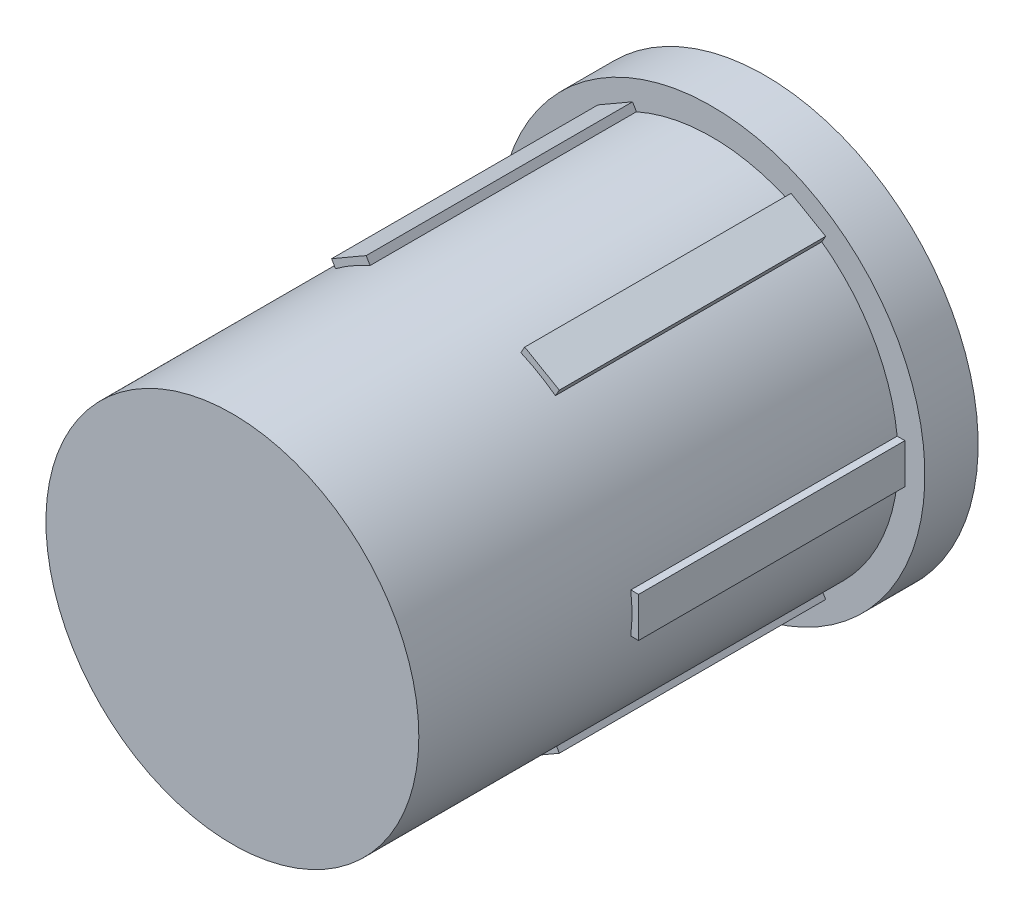
ISO-10303-21;
HEADER;
FILE_DESCRIPTION(('STEP AP214'),'2;1');
FILE_NAME('part.step','',(''),(''),'','','');
FILE_SCHEMA(('AUTOMOTIVE_DESIGN { 1 0 10303 214 1 1 1 1 }'));
ENDSEC;
DATA;
#1=APPLICATION_CONTEXT('core data for automotive mechanical design processes');
#2=APPLICATION_PROTOCOL_DEFINITION('international standard','automotive_design',2000,#1);
#3=PRODUCT_CONTEXT('',#1,'mechanical');
#4=PRODUCT('Part','Part','',(#3));
#5=PRODUCT_RELATED_PRODUCT_CATEGORY('part','',(#4));
#6=PRODUCT_DEFINITION_FORMATION('','',#4);
#7=PRODUCT_DEFINITION_CONTEXT('part definition',#1,'design');
#8=PRODUCT_DEFINITION('design','',#6,#7);
#9=PRODUCT_DEFINITION_SHAPE('','',#8);
#10=(LENGTH_UNIT() NAMED_UNIT(*) SI_UNIT(.MILLI.,.METRE.));
#11=(NAMED_UNIT(*) PLANE_ANGLE_UNIT() SI_UNIT($,.RADIAN.));
#12=(NAMED_UNIT(*) SI_UNIT($,.STERADIAN.) SOLID_ANGLE_UNIT());
#13=UNCERTAINTY_MEASURE_WITH_UNIT(LENGTH_MEASURE(1.E-05),#10,'distance_accuracy_value','');
#14=(GEOMETRIC_REPRESENTATION_CONTEXT(3) GLOBAL_UNCERTAINTY_ASSIGNED_CONTEXT((#13)) GLOBAL_UNIT_ASSIGNED_CONTEXT((#10,
#11,#12)) REPRESENTATION_CONTEXT('',''));
#15=CARTESIAN_POINT('',(0.,0.,0.));
#16=DIRECTION('',(0.,0.,1.));
#17=DIRECTION('',(1.,0.,0.));
#18=AXIS2_PLACEMENT_3D('',#15,#16,#17);
#19=CARTESIAN_POINT('',(0.,0.,3.6));
#20=DIRECTION('',(0.,0.,-1.));
#21=DIRECTION('',(-1.,0.,0.));
#22=AXIS2_PLACEMENT_3D('',#19,#20,#21);
#23=CYLINDRICAL_SURFACE('',#22,1.4);
#24=CARTESIAN_POINT('',(0.,0.,3.6));
#25=DIRECTION('',(0.,0.,1.));
#26=DIRECTION('',(1.,0.,0.));
#27=AXIS2_PLACEMENT_3D('',#24,#25,#26);
#28=CIRCLE('',#27,1.4);
#29=CARTESIAN_POINT('',(1.4,0.,3.6));
#30=VERTEX_POINT('',#29);
#31=EDGE_CURVE('E346',#30,#30,#28,.T.);
#32=ORIENTED_EDGE('',*,*,#31,.F.);
#33=EDGE_LOOP('',(#32));
#34=FACE_BOUND('',#33,.T.);
#35=CARTESIAN_POINT('',(0.,0.,0.));
#36=DIRECTION('',(0.,0.,-1.));
#37=DIRECTION('',(-1.,0.,0.));
#38=AXIS2_PLACEMENT_3D('',#35,#36,#37);
#39=CIRCLE('',#38,1.4);
#40=CARTESIAN_POINT('',(-0.825874355921432,-1.13045634512411,0.));
#41=VERTEX_POINT('',#40);
#42=CARTESIAN_POINT('',(-1.39194109070751,-0.15,0.));
#43=VERTEX_POINT('',#42);
#44=EDGE_CURVE('E341',#41,#43,#39,.T.);
#45=ORIENTED_EDGE('',*,*,#44,.F.);
#46=DIRECTION('',(0.,0.,-1.));
#47=VECTOR('',#46,1.);
#48=CARTESIAN_POINT('',(-0.825874355921432,-1.13045634512411,3.6));
#49=LINE('',#48,#47);
#50=CARTESIAN_POINT('',(-0.825874355921432,-1.13045634512411,2.));
#51=VERTEX_POINT('',#50);
#52=EDGE_CURVE('E50',#41,#51,#49,.F.);
#53=ORIENTED_EDGE('',*,*,#52,.T.);
#54=CARTESIAN_POINT('',(0.,0.,1.99999999999999));
#55=DIRECTION('',(0.,0.,-1.));
#56=DIRECTION('',(0.,1.,0.));
#57=AXIS2_PLACEMENT_3D('',#54,#55,#56);
#58=CIRCLE('',#57,1.4);
#59=CARTESIAN_POINT('',(-0.566066734786102,-1.28045634512411,2.));
#60=VERTEX_POINT('',#59);
#61=EDGE_CURVE('E11',#60,#51,#58,.T.);
#62=ORIENTED_EDGE('',*,*,#61,.F.);
#63=DIRECTION('',(0.,0.,-1.));
#64=VECTOR('',#63,1.);
#65=CARTESIAN_POINT('',(-0.566066734786102,-1.28045634512411,3.6));
#66=LINE('',#65,#64);
#67=CARTESIAN_POINT('',(-0.566066734786102,-1.28045634512411,0.));
#68=VERTEX_POINT('',#67);
#69=EDGE_CURVE('E215',#68,#60,#66,.F.);
#70=ORIENTED_EDGE('',*,*,#69,.F.);
#71=CARTESIAN_POINT('',(0.566066734786075,-1.28045634512412,0.));
#72=VERTEX_POINT('',#71);
#73=EDGE_CURVE('E395',#72,#68,#39,.T.);
#74=ORIENTED_EDGE('',*,*,#73,.F.);
#75=DIRECTION('',(0.,0.,-1.));
#76=VECTOR('',#75,1.);
#77=CARTESIAN_POINT('',(0.566066734786075,-1.28045634512412,3.6));
#78=LINE('',#77,#76);
#79=CARTESIAN_POINT('',(0.566066734786075,-1.28045634512412,2.));
#80=VERTEX_POINT('',#79);
#81=EDGE_CURVE('E243',#72,#80,#78,.F.);
#82=ORIENTED_EDGE('',*,*,#81,.T.);
#83=CARTESIAN_POINT('',(0.,0.,1.99999999999999));
#84=DIRECTION('',(0.,0.,-1.));
#85=DIRECTION('',(0.,1.,0.));
#86=AXIS2_PLACEMENT_3D('',#83,#84,#85);
#87=CIRCLE('',#86,1.4);
#88=CARTESIAN_POINT('',(0.825874355921408,-1.13045634512413,2.));
#89=VERTEX_POINT('',#88);
#90=EDGE_CURVE('E387',#89,#80,#87,.T.);
#91=ORIENTED_EDGE('',*,*,#90,.F.);
#92=DIRECTION('',(0.,0.,-1.));
#93=VECTOR('',#92,1.);
#94=CARTESIAN_POINT('',(0.825874355921408,-1.13045634512413,3.6));
#95=LINE('',#94,#93);
#96=CARTESIAN_POINT('',(0.825874355921408,-1.13045634512413,0.));
#97=VERTEX_POINT('',#96);
#98=EDGE_CURVE('E240',#97,#89,#95,.F.);
#99=ORIENTED_EDGE('',*,*,#98,.F.);
#100=CARTESIAN_POINT('',(1.39194109070751,-0.15,0.));
#101=VERTEX_POINT('',#100);
#102=EDGE_CURVE('E396',#101,#97,#39,.T.);
#103=ORIENTED_EDGE('',*,*,#102,.F.);
#104=DIRECTION('',(0.,0.,-1.));
#105=VECTOR('',#104,1.);
#106=CARTESIAN_POINT('',(1.39194109070751,-0.15,3.6));
#107=LINE('',#106,#105);
#108=CARTESIAN_POINT('',(1.39194109070751,-0.15,2.));
#109=VERTEX_POINT('',#108);
#110=EDGE_CURVE('E266',#101,#109,#107,.F.);
#111=ORIENTED_EDGE('',*,*,#110,.T.);
#112=CARTESIAN_POINT('',(0.,0.,1.99999999999999));
#113=DIRECTION('',(0.,0.,-1.));
#114=DIRECTION('',(-1.,0.,0.));
#115=AXIS2_PLACEMENT_3D('',#112,#113,#114);
#116=CIRCLE('',#115,1.4);
#117=CARTESIAN_POINT('',(1.39194109070751,0.15,2.));
#118=VERTEX_POINT('',#117);
#119=EDGE_CURVE('E379',#118,#109,#116,.T.);
#120=ORIENTED_EDGE('',*,*,#119,.F.);
#121=DIRECTION('',(0.,0.,-1.));
#122=VECTOR('',#121,1.);
#123=CARTESIAN_POINT('',(1.39194109070751,0.15,3.6));
#124=LINE('',#123,#122);
#125=CARTESIAN_POINT('',(1.39194109070751,0.15,0.));
#126=VERTEX_POINT('',#125);
#127=EDGE_CURVE('E263',#126,#118,#124,.F.);
#128=ORIENTED_EDGE('',*,*,#127,.F.);
#129=CARTESIAN_POINT('',(0.825874355921424,1.13045634512412,0.));
#130=VERTEX_POINT('',#129);
#131=EDGE_CURVE('E398',#130,#126,#39,.T.);
#132=ORIENTED_EDGE('',*,*,#131,.F.);
#133=DIRECTION('',(0.,0.,-1.));
#134=VECTOR('',#133,1.);
#135=CARTESIAN_POINT('',(0.825874355921424,1.13045634512412,3.6));
#136=LINE('',#135,#134);
#137=CARTESIAN_POINT('',(0.825874355921424,1.13045634512412,2.));
#138=VERTEX_POINT('',#137);
#139=EDGE_CURVE('E289',#130,#138,#136,.F.);
#140=ORIENTED_EDGE('',*,*,#139,.T.);
#141=CARTESIAN_POINT('',(0.,0.,1.99999999999999));
#142=DIRECTION('',(0.,0.,-1.));
#143=DIRECTION('',(0.,1.,0.));
#144=AXIS2_PLACEMENT_3D('',#141,#142,#143);
#145=CIRCLE('',#144,1.4);
#146=CARTESIAN_POINT('',(0.566066734786093,1.28045634512412,2.));
#147=VERTEX_POINT('',#146);
#148=EDGE_CURVE('E371',#147,#138,#145,.T.);
#149=ORIENTED_EDGE('',*,*,#148,.F.);
#150=DIRECTION('',(0.,0.,-1.));
#151=VECTOR('',#150,1.);
#152=CARTESIAN_POINT('',(0.566066734786093,1.28045634512412,3.6));
#153=LINE('',#152,#151);
#154=CARTESIAN_POINT('',(0.566066734786093,1.28045634512412,0.));
#155=VERTEX_POINT('',#154);
#156=EDGE_CURVE('E286',#155,#147,#153,.F.);
#157=ORIENTED_EDGE('',*,*,#156,.F.);
#158=CARTESIAN_POINT('',(-0.566066734786084,1.28045634512412,0.));
#159=VERTEX_POINT('',#158);
#160=EDGE_CURVE('E347',#159,#155,#39,.T.);
#161=ORIENTED_EDGE('',*,*,#160,.F.);
#162=DIRECTION('',(0.,0.,-1.));
#163=VECTOR('',#162,1.);
#164=CARTESIAN_POINT('',(-0.566066734786084,1.28045634512412,3.6));
#165=LINE('',#164,#163);
#166=CARTESIAN_POINT('',(-0.566066734786084,1.28045634512412,2.));
#167=VERTEX_POINT('',#166);
#168=EDGE_CURVE('E312',#159,#167,#165,.F.);
#169=ORIENTED_EDGE('',*,*,#168,.T.);
#170=CARTESIAN_POINT('',(0.,0.,1.99999999999999));
#171=DIRECTION('',(0.,0.,-1.));
#172=DIRECTION('',(0.,1.,0.));
#173=AXIS2_PLACEMENT_3D('',#170,#171,#172);
#174=CIRCLE('',#173,1.4);
#175=CARTESIAN_POINT('',(-0.825874355921416,1.13045634512412,2.));
#176=VERTEX_POINT('',#175);
#177=EDGE_CURVE('E363',#176,#167,#174,.T.);
#178=ORIENTED_EDGE('',*,*,#177,.F.);
#179=DIRECTION('',(0.,0.,-1.));
#180=VECTOR('',#179,1.);
#181=CARTESIAN_POINT('',(-0.825874355921416,1.13045634512412,3.6));
#182=LINE('',#181,#180);
#183=CARTESIAN_POINT('',(-0.825874355921416,1.13045634512412,0.));
#184=VERTEX_POINT('',#183);
#185=EDGE_CURVE('E309',#184,#176,#182,.F.);
#186=ORIENTED_EDGE('',*,*,#185,.F.);
#187=CARTESIAN_POINT('',(-1.39194109070751,0.15,0.));
#188=VERTEX_POINT('',#187);
#189=EDGE_CURVE('E344',#188,#184,#39,.T.);
#190=ORIENTED_EDGE('',*,*,#189,.F.);
#191=DIRECTION('',(0.,0.,-1.));
#192=VECTOR('',#191,1.);
#193=CARTESIAN_POINT('',(-1.39194109070751,0.15,3.6));
#194=LINE('',#193,#192);
#195=CARTESIAN_POINT('',(-1.39194109070751,0.15,2.));
#196=VERTEX_POINT('',#195);
#197=EDGE_CURVE('E335',#188,#196,#194,.F.);
#198=ORIENTED_EDGE('',*,*,#197,.T.);
#199=CARTESIAN_POINT('',(0.,0.,1.99999999999999));
#200=DIRECTION('',(0.,0.,-1.));
#201=DIRECTION('',(-1.,0.,0.));
#202=AXIS2_PLACEMENT_3D('',#199,#200,#201);
#203=CIRCLE('',#202,1.4);
#204=CARTESIAN_POINT('',(-1.39194109070751,-0.15,2.));
#205=VERTEX_POINT('',#204);
#206=EDGE_CURVE('E355',#205,#196,#203,.T.);
#207=ORIENTED_EDGE('',*,*,#206,.F.);
#208=DIRECTION('',(0.,0.,-1.));
#209=VECTOR('',#208,1.);
#210=CARTESIAN_POINT('',(-1.39194109070751,-0.15,3.6));
#211=LINE('',#210,#209);
#212=EDGE_CURVE('E332',#43,#205,#211,.F.);
#213=ORIENTED_EDGE('',*,*,#212,.F.);
#214=EDGE_LOOP('',(#45,#53,#62,#70,#74,#82,#91,#99,#103,#111,#120,#128,#132,#140,#149,#157,#161,
#169,#178,#186,#190,#198,#207,#213));
#215=FACE_BOUND('',#214,.T.);
#216=ADVANCED_FACE('F36',(#34,#215),#23,.T.);
#217=CARTESIAN_POINT('',(0.,0.,3.6));
#218=DIRECTION('',(0.,0.,1.));
#219=DIRECTION('',(1.,0.,0.));
#220=AXIS2_PLACEMENT_3D('',#217,#218,#219);
#221=PLANE('',#220);
#222=ORIENTED_EDGE('',*,*,#31,.T.);
#223=EDGE_LOOP('',(#222));
#224=FACE_BOUND('',#223,.T.);
#225=ADVANCED_FACE('F434',(#224),#221,.T.);
#226=CARTESIAN_POINT('',(0.,0.,0.));
#227=DIRECTION('',(0.,0.,-1.));
#228=DIRECTION('',(-1.,0.,0.));
#229=AXIS2_PLACEMENT_3D('',#226,#227,#228);
#230=PLANE('',#229);
#231=CARTESIAN_POINT('',(0.,0.,0.));
#232=DIRECTION('',(0.,0.,-1.));
#233=DIRECTION('',(-1.,0.,0.));
#234=AXIS2_PLACEMENT_3D('',#231,#232,#233);
#235=CIRCLE('',#234,1.6);
#236=CARTESIAN_POINT('',(-1.6,0.,0.));
#237=VERTEX_POINT('',#236);
#238=EDGE_CURVE('E337',#237,#237,#235,.T.);
#239=ORIENTED_EDGE('',*,*,#238,.F.);
#240=EDGE_LOOP('',(#239));
#241=FACE_BOUND('',#240,.T.);
#242=DIRECTION('',(0.866025403784433,-0.50000000000001,0.));
#243=VECTOR('',#242,1.);
#244=CARTESIAN_POINT('',(-0.85490381056768,-1.18073683548743,0.));
#245=LINE('',#244,#243);
#246=CARTESIAN_POINT('',(-0.85490381056768,-1.18073683548743,0.));
#247=VERTEX_POINT('',#246);
#248=CARTESIAN_POINT('',(-0.59509618943235,-1.33073683548743,0.));
#249=VERTEX_POINT('',#248);
#250=EDGE_CURVE('E202',#247,#249,#245,.T.);
#251=ORIENTED_EDGE('',*,*,#250,.F.);
#252=DIRECTION('',(0.50000000000001,0.866025403784433,0.));
#253=VECTOR('',#252,1.);
#254=CARTESIAN_POINT('',(-0.129903810567665,0.0750000000000015,0.));
#255=LINE('',#254,#253);
#256=EDGE_CURVE('E43',#247,#41,#255,.T.);
#257=ORIENTED_EDGE('',*,*,#256,.T.);
#258=ORIENTED_EDGE('',*,*,#44,.T.);
#259=DIRECTION('',(1.,0.,0.));
#260=VECTOR('',#259,1.);
#261=CARTESIAN_POINT('',(0.,-0.15,0.));
#262=LINE('',#261,#260);
#263=CARTESIAN_POINT('',(-1.45,-0.15,0.));
#264=VERTEX_POINT('',#263);
#265=EDGE_CURVE('E350',#264,#43,#262,.T.);
#266=ORIENTED_EDGE('',*,*,#265,.F.);
#267=DIRECTION('',(0.,-1.,0.));
#268=VECTOR('',#267,1.);
#269=CARTESIAN_POINT('',(-1.45,0.15,0.));
#270=LINE('',#269,#268);
#271=CARTESIAN_POINT('',(-1.45,0.15,0.));
#272=VERTEX_POINT('',#271);
#273=EDGE_CURVE('E322',#272,#264,#270,.T.);
#274=ORIENTED_EDGE('',*,*,#273,.F.);
#275=DIRECTION('',(1.,0.,0.));
#276=VECTOR('',#275,1.);
#277=CARTESIAN_POINT('',(0.,0.15,0.));
#278=LINE('',#277,#276);
#279=EDGE_CURVE('E353',#272,#188,#278,.T.);
#280=ORIENTED_EDGE('',*,*,#279,.T.);
#281=ORIENTED_EDGE('',*,*,#189,.T.);
#282=DIRECTION('',(0.499999999999998,-0.86602540378444,0.));
#283=VECTOR('',#282,1.);
#284=CARTESIAN_POINT('',(-0.129903810567666,-0.0749999999999997,0.));
#285=LINE('',#284,#283);
#286=CARTESIAN_POINT('',(-0.854903810567663,1.18073683548744,0.));
#287=VERTEX_POINT('',#286);
#288=EDGE_CURVE('E358',#287,#184,#285,.T.);
#289=ORIENTED_EDGE('',*,*,#288,.F.);
#290=DIRECTION('',(-0.86602540378444,-0.499999999999998,0.));
#291=VECTOR('',#290,1.);
#292=CARTESIAN_POINT('',(-0.595096189432331,1.33073683548744,0.));
#293=LINE('',#292,#291);
#294=CARTESIAN_POINT('',(-0.595096189432331,1.33073683548744,0.));
#295=VERTEX_POINT('',#294);
#296=EDGE_CURVE('E299',#295,#287,#293,.T.);
#297=ORIENTED_EDGE('',*,*,#296,.F.);
#298=DIRECTION('',(0.499999999999998,-0.86602540378444,0.));
#299=VECTOR('',#298,1.);
#300=CARTESIAN_POINT('',(0.129903810567666,0.0749999999999997,0.));
#301=LINE('',#300,#299);
#302=EDGE_CURVE('E361',#295,#159,#301,.T.);
#303=ORIENTED_EDGE('',*,*,#302,.T.);
#304=ORIENTED_EDGE('',*,*,#160,.T.);
#305=DIRECTION('',(-0.500000000000004,-0.866025403784436,0.));
#306=VECTOR('',#305,1.);
#307=CARTESIAN_POINT('',(-0.129903810567665,0.0750000000000006,0.));
#308=LINE('',#307,#306);
#309=CARTESIAN_POINT('',(0.59509618943234,1.33073683548743,0.));
#310=VERTEX_POINT('',#309);
#311=EDGE_CURVE('E366',#310,#155,#308,.T.);
#312=ORIENTED_EDGE('',*,*,#311,.F.);
#313=DIRECTION('',(-0.866025403784436,0.500000000000004,0.));
#314=VECTOR('',#313,1.);
#315=CARTESIAN_POINT('',(0.854903810567671,1.18073683548743,0.));
#316=LINE('',#315,#314);
#317=CARTESIAN_POINT('',(0.854903810567671,1.18073683548743,0.));
#318=VERTEX_POINT('',#317);
#319=EDGE_CURVE('E276',#318,#310,#316,.T.);
#320=ORIENTED_EDGE('',*,*,#319,.F.);
#321=DIRECTION('',(-0.500000000000004,-0.866025403784436,0.));
#322=VECTOR('',#321,1.);
#323=CARTESIAN_POINT('',(0.129903810567665,-0.0750000000000006,0.));
#324=LINE('',#323,#322);
#325=EDGE_CURVE('E369',#318,#130,#324,.T.);
#326=ORIENTED_EDGE('',*,*,#325,.T.);
#327=ORIENTED_EDGE('',*,*,#131,.T.);
#328=DIRECTION('',(-1.,0.,0.));
#329=VECTOR('',#328,1.);
#330=CARTESIAN_POINT('',(0.,0.15,0.));
#331=LINE('',#330,#329);
#332=CARTESIAN_POINT('',(1.45,0.15,0.));
#333=VERTEX_POINT('',#332);
#334=EDGE_CURVE('E374',#333,#126,#331,.T.);
#335=ORIENTED_EDGE('',*,*,#334,.F.);
#336=DIRECTION('',(0.,1.,0.));
#337=VECTOR('',#336,1.);
#338=CARTESIAN_POINT('',(1.45,-0.15,0.));
#339=LINE('',#338,#337);
#340=CARTESIAN_POINT('',(1.45,-0.15,0.));
#341=VERTEX_POINT('',#340);
#342=EDGE_CURVE('E253',#341,#333,#339,.T.);
#343=ORIENTED_EDGE('',*,*,#342,.F.);
#344=DIRECTION('',(-1.,0.,0.));
#345=VECTOR('',#344,1.);
#346=CARTESIAN_POINT('',(0.,-0.15,0.));
#347=LINE('',#346,#345);
#348=EDGE_CURVE('E377',#341,#101,#347,.T.);
#349=ORIENTED_EDGE('',*,*,#348,.T.);
#350=ORIENTED_EDGE('',*,*,#102,.T.);
#351=DIRECTION('',(-0.499999999999992,0.866025403784443,0.));
#352=VECTOR('',#351,1.);
#353=CARTESIAN_POINT('',(0.129903810567666,0.0749999999999988,0.));
#354=LINE('',#353,#352);
#355=CARTESIAN_POINT('',(0.854903810567655,-1.18073683548744,0.));
#356=VERTEX_POINT('',#355);
#357=EDGE_CURVE('E382',#356,#97,#354,.T.);
#358=ORIENTED_EDGE('',*,*,#357,.F.);
#359=DIRECTION('',(0.866025403784443,0.499999999999992,0.));
#360=VECTOR('',#359,1.);
#361=CARTESIAN_POINT('',(0.595096189432322,-1.33073683548744,0.));
#362=LINE('',#361,#360);
#363=CARTESIAN_POINT('',(0.595096189432322,-1.33073683548744,0.));
#364=VERTEX_POINT('',#363);
#365=EDGE_CURVE('E230',#364,#356,#362,.T.);
#366=ORIENTED_EDGE('',*,*,#365,.F.);
#367=DIRECTION('',(-0.499999999999992,0.866025403784443,0.));
#368=VECTOR('',#367,1.);
#369=CARTESIAN_POINT('',(-0.129903810567666,-0.0749999999999988,0.));
#370=LINE('',#369,#368);
#371=EDGE_CURVE('E385',#364,#72,#370,.T.);
#372=ORIENTED_EDGE('',*,*,#371,.T.);
#373=ORIENTED_EDGE('',*,*,#73,.T.);
#374=DIRECTION('',(0.50000000000001,0.866025403784433,0.));
#375=VECTOR('',#374,1.);
#376=CARTESIAN_POINT('',(0.129903810567665,-0.0750000000000015,0.));
#377=LINE('',#376,#375);
#378=EDGE_CURVE('E390',#249,#68,#377,.T.);
#379=ORIENTED_EDGE('',*,*,#378,.F.);
#380=EDGE_LOOP('',(#251,#257,#258,#266,#274,#280,#281,#289,#297,#303,#304,#312,#320,#326,#327,
#335,#343,#349,#350,#358,#366,#372,#373,#379));
#381=FACE_BOUND('',#380,.T.);
#382=ADVANCED_FACE('F393',(#241,#381),#230,.F.);
#383=CARTESIAN_POINT('',(0.,0.,-0.4));
#384=DIRECTION('',(0.,0.,1.));
#385=DIRECTION('',(1.,0.,0.));
#386=AXIS2_PLACEMENT_3D('',#383,#384,#385);
#387=CYLINDRICAL_SURFACE('',#386,1.6);
#388=CARTESIAN_POINT('',(0.,0.,-0.4));
#389=DIRECTION('',(0.,0.,-1.));
#390=DIRECTION('',(-1.,0.,0.));
#391=AXIS2_PLACEMENT_3D('',#388,#389,#390);
#392=CIRCLE('',#391,1.6);
#393=CARTESIAN_POINT('',(-1.6,0.,-0.4));
#394=VERTEX_POINT('',#393);
#395=EDGE_CURVE('E338',#394,#394,#392,.T.);
#396=ORIENTED_EDGE('',*,*,#395,.F.);
#397=EDGE_LOOP('',(#396));
#398=FACE_BOUND('',#397,.T.);
#399=ORIENTED_EDGE('',*,*,#238,.T.);
#400=EDGE_LOOP('',(#399));
#401=FACE_BOUND('',#400,.T.);
#402=ADVANCED_FACE('F444',(#398,#401),#387,.T.);
#403=CARTESIAN_POINT('',(0.,0.,-0.4));
#404=DIRECTION('',(0.,0.,-1.));
#405=DIRECTION('',(-1.,0.,0.));
#406=AXIS2_PLACEMENT_3D('',#403,#404,#405);
#407=PLANE('',#406);
#408=ORIENTED_EDGE('',*,*,#395,.T.);
#409=EDGE_LOOP('',(#408));
#410=FACE_BOUND('',#409,.T.);
#411=ADVANCED_FACE('F449',(#410),#407,.T.);
#412=CARTESIAN_POINT('',(-1.45,0.15,2.));
#413=DIRECTION('',(0.,0.,-1.));
#414=DIRECTION('',(-1.,0.,0.));
#415=AXIS2_PLACEMENT_3D('',#412,#413,#414);
#416=PLANE('',#415);
#417=DIRECTION('',(1.,0.,0.));
#418=VECTOR('',#417,1.);
#419=CARTESIAN_POINT('',(-1.45,-0.15,2.));
#420=LINE('',#419,#418);
#421=CARTESIAN_POINT('',(-1.45,-0.15,2.));
#422=VERTEX_POINT('',#421);
#423=EDGE_CURVE('E319',#422,#205,#420,.T.);
#424=ORIENTED_EDGE('',*,*,#423,.T.);
#425=ORIENTED_EDGE('',*,*,#206,.T.);
#426=DIRECTION('',(1.,0.,0.));
#427=VECTOR('',#426,1.);
#428=CARTESIAN_POINT('',(-1.45,0.15,2.));
#429=LINE('',#428,#427);
#430=CARTESIAN_POINT('',(-1.45,0.15,2.));
#431=VERTEX_POINT('',#430);
#432=EDGE_CURVE('E318',#431,#196,#429,.T.);
#433=ORIENTED_EDGE('',*,*,#432,.F.);
#434=DIRECTION('',(0.,-1.,0.));
#435=VECTOR('',#434,1.);
#436=CARTESIAN_POINT('',(-1.45,0.15,2.));
#437=LINE('',#436,#435);
#438=EDGE_CURVE('E329',#431,#422,#437,.T.);
#439=ORIENTED_EDGE('',*,*,#438,.T.);
#440=EDGE_LOOP('',(#424,#425,#433,#439));
#441=FACE_BOUND('',#440,.T.);
#442=ADVANCED_FACE('F454',(#441),#416,.F.);
#443=CARTESIAN_POINT('',(0.,0.15,0.));
#444=DIRECTION('',(0.,1.,0.));
#445=DIRECTION('',(0.,0.,1.));
#446=AXIS2_PLACEMENT_3D('',#443,#444,#445);
#447=PLANE('',#446);
#448=ORIENTED_EDGE('',*,*,#197,.F.);
#449=ORIENTED_EDGE('',*,*,#279,.F.);
#450=DIRECTION('',(0.,0.,1.));
#451=VECTOR('',#450,1.);
#452=CARTESIAN_POINT('',(-1.45,0.15,0.));
#453=LINE('',#452,#451);
#454=EDGE_CURVE('E315',#272,#431,#453,.T.);
#455=ORIENTED_EDGE('',*,*,#454,.T.);
#456=ORIENTED_EDGE('',*,*,#432,.T.);
#457=EDGE_LOOP('',(#448,#449,#455,#456));
#458=FACE_BOUND('',#457,.T.);
#459=ADVANCED_FACE('F464',(#458),#447,.T.);
#460=CARTESIAN_POINT('',(0.,-0.15,0.));
#461=DIRECTION('',(0.,1.,0.));
#462=DIRECTION('',(0.,0.,1.));
#463=AXIS2_PLACEMENT_3D('',#460,#461,#462);
#464=PLANE('',#463);
#465=ORIENTED_EDGE('',*,*,#265,.T.);
#466=ORIENTED_EDGE('',*,*,#212,.T.);
#467=ORIENTED_EDGE('',*,*,#423,.F.);
#468=DIRECTION('',(0.,0.,1.));
#469=VECTOR('',#468,1.);
#470=CARTESIAN_POINT('',(-1.45,-0.15,0.));
#471=LINE('',#470,#469);
#472=EDGE_CURVE('E314',#264,#422,#471,.T.);
#473=ORIENTED_EDGE('',*,*,#472,.F.);
#474=EDGE_LOOP('',(#465,#466,#467,#473));
#475=FACE_BOUND('',#474,.T.);
#476=ADVANCED_FACE('F460',(#475),#464,.F.);
#477=CARTESIAN_POINT('',(-1.45,0.15,0.));
#478=DIRECTION('',(1.,0.,0.));
#479=DIRECTION('',(0.,0.,-1.));
#480=AXIS2_PLACEMENT_3D('',#477,#478,#479);
#481=PLANE('',#480);
#482=ORIENTED_EDGE('',*,*,#472,.T.);
#483=ORIENTED_EDGE('',*,*,#438,.F.);
#484=ORIENTED_EDGE('',*,*,#454,.F.);
#485=ORIENTED_EDGE('',*,*,#273,.T.);
#486=EDGE_LOOP('',(#482,#483,#484,#485));
#487=FACE_BOUND('',#486,.T.);
#488=ADVANCED_FACE('F456',(#487),#481,.F.);
#489=CARTESIAN_POINT('',(-0.595096189432331,1.33073683548744,2.));
#490=DIRECTION('',(0.,0.,-1.));
#491=DIRECTION('',(0.,1.,0.));
#492=AXIS2_PLACEMENT_3D('',#489,#490,#491);
#493=PLANE('',#492);
#494=DIRECTION('',(0.499999999999998,-0.86602540378444,0.));
#495=VECTOR('',#494,1.);
#496=CARTESIAN_POINT('',(-0.854903810567663,1.18073683548744,2.));
#497=LINE('',#496,#495);
#498=CARTESIAN_POINT('',(-0.854903810567663,1.18073683548744,2.));
#499=VERTEX_POINT('',#498);
#500=EDGE_CURVE('E296',#499,#176,#497,.T.);
#501=ORIENTED_EDGE('',*,*,#500,.T.);
#502=ORIENTED_EDGE('',*,*,#177,.T.);
#503=DIRECTION('',(0.499999999999998,-0.86602540378444,0.));
#504=VECTOR('',#503,1.);
#505=CARTESIAN_POINT('',(-0.595096189432331,1.33073683548744,2.));
#506=LINE('',#505,#504);
#507=CARTESIAN_POINT('',(-0.595096189432331,1.33073683548744,2.));
#508=VERTEX_POINT('',#507);
#509=EDGE_CURVE('E295',#508,#167,#506,.T.);
#510=ORIENTED_EDGE('',*,*,#509,.F.);
#511=DIRECTION('',(-0.86602540378444,-0.499999999999998,0.));
#512=VECTOR('',#511,1.);
#513=CARTESIAN_POINT('',(-0.595096189432331,1.33073683548744,2.));
#514=LINE('',#513,#512);
#515=EDGE_CURVE('E306',#508,#499,#514,.T.);
#516=ORIENTED_EDGE('',*,*,#515,.T.);
#517=EDGE_LOOP('',(#501,#502,#510,#516));
#518=FACE_BOUND('',#517,.T.);
#519=ADVANCED_FACE('F459',(#518),#493,.F.);
#520=CARTESIAN_POINT('',(0.129903810567666,0.0749999999999997,0.));
#521=DIRECTION('',(0.86602540378444,0.499999999999998,0.));
#522=DIRECTION('',(0.,0.,1.));
#523=AXIS2_PLACEMENT_3D('',#520,#521,#522);
#524=PLANE('',#523);
#525=ORIENTED_EDGE('',*,*,#168,.F.);
#526=ORIENTED_EDGE('',*,*,#302,.F.);
#527=DIRECTION('',(0.,0.,1.));
#528=VECTOR('',#527,1.);
#529=CARTESIAN_POINT('',(-0.595096189432331,1.33073683548744,0.));
#530=LINE('',#529,#528);
#531=EDGE_CURVE('E292',#295,#508,#530,.T.);
#532=ORIENTED_EDGE('',*,*,#531,.T.);
#533=ORIENTED_EDGE('',*,*,#509,.T.);
#534=EDGE_LOOP('',(#525,#526,#532,#533));
#535=FACE_BOUND('',#534,.T.);
#536=ADVANCED_FACE('F474',(#535),#524,.T.);
#537=CARTESIAN_POINT('',(-0.129903810567666,-0.0749999999999997,0.));
#538=DIRECTION('',(0.86602540378444,0.499999999999998,0.));
#539=DIRECTION('',(0.,0.,1.));
#540=AXIS2_PLACEMENT_3D('',#537,#538,#539);
#541=PLANE('',#540);
#542=ORIENTED_EDGE('',*,*,#288,.T.);
#543=ORIENTED_EDGE('',*,*,#185,.T.);
#544=ORIENTED_EDGE('',*,*,#500,.F.);
#545=DIRECTION('',(0.,0.,1.));
#546=VECTOR('',#545,1.);
#547=CARTESIAN_POINT('',(-0.854903810567663,1.18073683548744,0.));
#548=LINE('',#547,#546);
#549=EDGE_CURVE('E291',#287,#499,#548,.T.);
#550=ORIENTED_EDGE('',*,*,#549,.F.);
#551=EDGE_LOOP('',(#542,#543,#544,#550));
#552=FACE_BOUND('',#551,.T.);
#553=ADVANCED_FACE('F428',(#552),#541,.F.);
#554=CARTESIAN_POINT('',(-0.595096189432331,1.33073683548744,0.));
#555=DIRECTION('',(0.499999999999998,-0.86602540378444,0.));
#556=DIRECTION('',(0.86602540378444,0.499999999999998,0.));
#557=AXIS2_PLACEMENT_3D('',#554,#555,#556);
#558=PLANE('',#557);
#559=ORIENTED_EDGE('',*,*,#549,.T.);
#560=ORIENTED_EDGE('',*,*,#515,.F.);
#561=ORIENTED_EDGE('',*,*,#531,.F.);
#562=ORIENTED_EDGE('',*,*,#296,.T.);
#563=EDGE_LOOP('',(#559,#560,#561,#562));
#564=FACE_BOUND('',#563,.T.);
#565=ADVANCED_FACE('F421',(#564),#558,.F.);
#566=CARTESIAN_POINT('',(0.854903810567671,1.18073683548743,2.));
#567=DIRECTION('',(0.,0.,-1.));
#568=DIRECTION('',(0.,1.,0.));
#569=AXIS2_PLACEMENT_3D('',#566,#567,#568);
#570=PLANE('',#569);
#571=DIRECTION('',(-0.500000000000004,-0.866025403784436,0.));
#572=VECTOR('',#571,1.);
#573=CARTESIAN_POINT('',(0.595096189432341,1.33073683548743,2.));
#574=LINE('',#573,#572);
#575=CARTESIAN_POINT('',(0.595096189432341,1.33073683548743,2.));
#576=VERTEX_POINT('',#575);
#577=EDGE_CURVE('E273',#576,#147,#574,.T.);
#578=ORIENTED_EDGE('',*,*,#577,.T.);
#579=ORIENTED_EDGE('',*,*,#148,.T.);
#580=DIRECTION('',(-0.500000000000004,-0.866025403784436,0.));
#581=VECTOR('',#580,1.);
#582=CARTESIAN_POINT('',(0.854903810567671,1.18073683548743,2.));
#583=LINE('',#582,#581);
#584=CARTESIAN_POINT('',(0.854903810567671,1.18073683548743,2.));
#585=VERTEX_POINT('',#584);
#586=EDGE_CURVE('E272',#585,#138,#583,.T.);
#587=ORIENTED_EDGE('',*,*,#586,.F.);
#588=DIRECTION('',(-0.866025403784436,0.500000000000004,0.));
#589=VECTOR('',#588,1.);
#590=CARTESIAN_POINT('',(0.854903810567671,1.18073683548743,2.));
#591=LINE('',#590,#589);
#592=EDGE_CURVE('E283',#585,#576,#591,.T.);
#593=ORIENTED_EDGE('',*,*,#592,.T.);
#594=EDGE_LOOP('',(#578,#579,#587,#593));
#595=FACE_BOUND('',#594,.T.);
#596=ADVANCED_FACE('F419',(#595),#570,.F.);
#597=CARTESIAN_POINT('',(0.129903810567665,-0.0750000000000006,0.));
#598=DIRECTION('',(0.866025403784436,-0.500000000000004,0.));
#599=DIRECTION('',(0.,0.,1.));
#600=AXIS2_PLACEMENT_3D('',#597,#598,#599);
#601=PLANE('',#600);
#602=ORIENTED_EDGE('',*,*,#139,.F.);
#603=ORIENTED_EDGE('',*,*,#325,.F.);
#604=DIRECTION('',(0.,0.,1.));
#605=VECTOR('',#604,1.);
#606=CARTESIAN_POINT('',(0.854903810567671,1.18073683548743,0.));
#607=LINE('',#606,#605);
#608=EDGE_CURVE('E269',#318,#585,#607,.T.);
#609=ORIENTED_EDGE('',*,*,#608,.T.);
#610=ORIENTED_EDGE('',*,*,#586,.T.);
#611=EDGE_LOOP('',(#602,#603,#609,#610));
#612=FACE_BOUND('',#611,.T.);
#613=ADVANCED_FACE('F417',(#612),#601,.T.);
#614=CARTESIAN_POINT('',(-0.129903810567665,0.0750000000000006,0.));
#615=DIRECTION('',(0.866025403784436,-0.500000000000004,0.));
#616=DIRECTION('',(0.,0.,1.));
#617=AXIS2_PLACEMENT_3D('',#614,#615,#616);
#618=PLANE('',#617);
#619=ORIENTED_EDGE('',*,*,#311,.T.);
#620=ORIENTED_EDGE('',*,*,#156,.T.);
#621=ORIENTED_EDGE('',*,*,#577,.F.);
#622=DIRECTION('',(0.,0.,1.));
#623=VECTOR('',#622,1.);
#624=CARTESIAN_POINT('',(0.595096189432341,1.33073683548743,0.));
#625=LINE('',#624,#623);
#626=EDGE_CURVE('E268',#310,#576,#625,.T.);
#627=ORIENTED_EDGE('',*,*,#626,.F.);
#628=EDGE_LOOP('',(#619,#620,#621,#627));
#629=FACE_BOUND('',#628,.T.);
#630=ADVANCED_FACE('F409',(#629),#618,.F.);
#631=CARTESIAN_POINT('',(0.854903810567671,1.18073683548743,0.));
#632=DIRECTION('',(-0.500000000000004,-0.866025403784436,0.));
#633=DIRECTION('',(0.866025403784436,-0.500000000000004,0.));
#634=AXIS2_PLACEMENT_3D('',#631,#632,#633);
#635=PLANE('',#634);
#636=ORIENTED_EDGE('',*,*,#626,.T.);
#637=ORIENTED_EDGE('',*,*,#592,.F.);
#638=ORIENTED_EDGE('',*,*,#608,.F.);
#639=ORIENTED_EDGE('',*,*,#319,.T.);
#640=EDGE_LOOP('',(#636,#637,#638,#639));
#641=FACE_BOUND('',#640,.T.);
#642=ADVANCED_FACE('F412',(#641),#635,.F.);
#643=CARTESIAN_POINT('',(1.45,-0.15,2.));
#644=DIRECTION('',(0.,0.,-1.));
#645=DIRECTION('',(-1.,0.,0.));
#646=AXIS2_PLACEMENT_3D('',#643,#644,#645);
#647=PLANE('',#646);
#648=DIRECTION('',(-1.,0.,0.));
#649=VECTOR('',#648,1.);
#650=CARTESIAN_POINT('',(1.45,0.15,2.));
#651=LINE('',#650,#649);
#652=CARTESIAN_POINT('',(1.45,0.15,2.));
#653=VERTEX_POINT('',#652);
#654=EDGE_CURVE('E250',#653,#118,#651,.T.);
#655=ORIENTED_EDGE('',*,*,#654,.T.);
#656=ORIENTED_EDGE('',*,*,#119,.T.);
#657=DIRECTION('',(-1.,0.,0.));
#658=VECTOR('',#657,1.);
#659=CARTESIAN_POINT('',(1.45,-0.15,2.));
#660=LINE('',#659,#658);
#661=CARTESIAN_POINT('',(1.45,-0.15,2.));
#662=VERTEX_POINT('',#661);
#663=EDGE_CURVE('E249',#662,#109,#660,.T.);
#664=ORIENTED_EDGE('',*,*,#663,.F.);
#665=DIRECTION('',(0.,1.,0.));
#666=VECTOR('',#665,1.);
#667=CARTESIAN_POINT('',(1.45,-0.15,2.));
#668=LINE('',#667,#666);
#669=EDGE_CURVE('E260',#662,#653,#668,.T.);
#670=ORIENTED_EDGE('',*,*,#669,.T.);
#671=EDGE_LOOP('',(#655,#656,#664,#670));
#672=FACE_BOUND('',#671,.T.);
#673=ADVANCED_FACE('F482',(#672),#647,.F.);
#674=CARTESIAN_POINT('',(0.,-0.15,0.));
#675=DIRECTION('',(0.,-1.,0.));
#676=DIRECTION('',(0.,0.,1.));
#677=AXIS2_PLACEMENT_3D('',#674,#675,#676);
#678=PLANE('',#677);
#679=ORIENTED_EDGE('',*,*,#110,.F.);
#680=ORIENTED_EDGE('',*,*,#348,.F.);
#681=DIRECTION('',(0.,0.,1.));
#682=VECTOR('',#681,1.);
#683=CARTESIAN_POINT('',(1.45,-0.15,0.));
#684=LINE('',#683,#682);
#685=EDGE_CURVE('E246',#341,#662,#684,.T.);
#686=ORIENTED_EDGE('',*,*,#685,.T.);
#687=ORIENTED_EDGE('',*,*,#663,.T.);
#688=EDGE_LOOP('',(#679,#680,#686,#687));
#689=FACE_BOUND('',#688,.T.);
#690=ADVANCED_FACE('F487',(#689),#678,.T.);
#691=CARTESIAN_POINT('',(0.,0.15,0.));
#692=DIRECTION('',(0.,-1.,0.));
#693=DIRECTION('',(0.,0.,1.));
#694=AXIS2_PLACEMENT_3D('',#691,#692,#693);
#695=PLANE('',#694);
#696=ORIENTED_EDGE('',*,*,#334,.T.);
#697=ORIENTED_EDGE('',*,*,#127,.T.);
#698=ORIENTED_EDGE('',*,*,#654,.F.);
#699=DIRECTION('',(0.,0.,1.));
#700=VECTOR('',#699,1.);
#701=CARTESIAN_POINT('',(1.45,0.15,0.));
#702=LINE('',#701,#700);
#703=EDGE_CURVE('E245',#333,#653,#702,.T.);
#704=ORIENTED_EDGE('',*,*,#703,.F.);
#705=EDGE_LOOP('',(#696,#697,#698,#704));
#706=FACE_BOUND('',#705,.T.);
#707=ADVANCED_FACE('F496',(#706),#695,.F.);
#708=CARTESIAN_POINT('',(1.45,-0.15,0.));
#709=DIRECTION('',(-1.,0.,0.));
#710=DIRECTION('',(0.,0.,1.));
#711=AXIS2_PLACEMENT_3D('',#708,#709,#710);
#712=PLANE('',#711);
#713=ORIENTED_EDGE('',*,*,#703,.T.);
#714=ORIENTED_EDGE('',*,*,#669,.F.);
#715=ORIENTED_EDGE('',*,*,#685,.F.);
#716=ORIENTED_EDGE('',*,*,#342,.T.);
#717=EDGE_LOOP('',(#713,#714,#715,#716));
#718=FACE_BOUND('',#717,.T.);
#719=ADVANCED_FACE('F493',(#718),#712,.F.);
#720=CARTESIAN_POINT('',(0.595096189432322,-1.33073683548744,2.));
#721=DIRECTION('',(0.,0.,-1.));
#722=DIRECTION('',(0.,1.,0.));
#723=AXIS2_PLACEMENT_3D('',#720,#721,#722);
#724=PLANE('',#723);
#725=DIRECTION('',(-0.499999999999992,0.866025403784443,0.));
#726=VECTOR('',#725,1.);
#727=CARTESIAN_POINT('',(0.854903810567655,-1.18073683548744,2.));
#728=LINE('',#727,#726);
#729=CARTESIAN_POINT('',(0.854903810567655,-1.18073683548744,2.));
#730=VERTEX_POINT('',#729);
#731=EDGE_CURVE('E227',#730,#89,#728,.T.);
#732=ORIENTED_EDGE('',*,*,#731,.T.);
#733=ORIENTED_EDGE('',*,*,#90,.T.);
#734=DIRECTION('',(-0.499999999999992,0.866025403784443,0.));
#735=VECTOR('',#734,1.);
#736=CARTESIAN_POINT('',(0.595096189432322,-1.33073683548744,2.));
#737=LINE('',#736,#735);
#738=CARTESIAN_POINT('',(0.595096189432322,-1.33073683548744,2.));
#739=VERTEX_POINT('',#738);
#740=EDGE_CURVE('E226',#739,#80,#737,.T.);
#741=ORIENTED_EDGE('',*,*,#740,.F.);
#742=DIRECTION('',(0.866025403784443,0.499999999999992,0.));
#743=VECTOR('',#742,1.);
#744=CARTESIAN_POINT('',(0.595096189432322,-1.33073683548744,2.));
#745=LINE('',#744,#743);
#746=EDGE_CURVE('E237',#739,#730,#745,.T.);
#747=ORIENTED_EDGE('',*,*,#746,.T.);
#748=EDGE_LOOP('',(#732,#733,#741,#747));
#749=FACE_BOUND('',#748,.T.);
#750=ADVANCED_FACE('F495',(#749),#724,.F.);
#751=CARTESIAN_POINT('',(-0.129903810567666,-0.0749999999999988,0.));
#752=DIRECTION('',(-0.866025403784443,-0.499999999999992,0.));
#753=DIRECTION('',(0.,0.,1.));
#754=AXIS2_PLACEMENT_3D('',#751,#752,#753);
#755=PLANE('',#754);
#756=ORIENTED_EDGE('',*,*,#81,.F.);
#757=ORIENTED_EDGE('',*,*,#371,.F.);
#758=DIRECTION('',(0.,0.,1.));
#759=VECTOR('',#758,1.);
#760=CARTESIAN_POINT('',(0.595096189432322,-1.33073683548744,0.));
#761=LINE('',#760,#759);
#762=EDGE_CURVE('E223',#364,#739,#761,.T.);
#763=ORIENTED_EDGE('',*,*,#762,.T.);
#764=ORIENTED_EDGE('',*,*,#740,.T.);
#765=EDGE_LOOP('',(#756,#757,#763,#764));
#766=FACE_BOUND('',#765,.T.);
#767=ADVANCED_FACE('F512',(#766),#755,.T.);
#768=CARTESIAN_POINT('',(0.129903810567666,0.0749999999999988,0.));
#769=DIRECTION('',(-0.866025403784443,-0.499999999999992,0.));
#770=DIRECTION('',(0.,0.,1.));
#771=AXIS2_PLACEMENT_3D('',#768,#769,#770);
#772=PLANE('',#771);
#773=ORIENTED_EDGE('',*,*,#357,.T.);
#774=ORIENTED_EDGE('',*,*,#98,.T.);
#775=ORIENTED_EDGE('',*,*,#731,.F.);
#776=DIRECTION('',(0.,0.,1.));
#777=VECTOR('',#776,1.);
#778=CARTESIAN_POINT('',(0.854903810567655,-1.18073683548744,0.));
#779=LINE('',#778,#777);
#780=EDGE_CURVE('E222',#356,#730,#779,.T.);
#781=ORIENTED_EDGE('',*,*,#780,.F.);
#782=EDGE_LOOP('',(#773,#774,#775,#781));
#783=FACE_BOUND('',#782,.T.);
#784=ADVANCED_FACE('F508',(#783),#772,.F.);
#785=CARTESIAN_POINT('',(0.595096189432322,-1.33073683548744,0.));
#786=DIRECTION('',(-0.499999999999992,0.866025403784443,0.));
#787=DIRECTION('',(-0.866025403784443,-0.499999999999992,0.));
#788=AXIS2_PLACEMENT_3D('',#785,#786,#787);
#789=PLANE('',#788);
#790=ORIENTED_EDGE('',*,*,#780,.T.);
#791=ORIENTED_EDGE('',*,*,#746,.F.);
#792=ORIENTED_EDGE('',*,*,#762,.F.);
#793=ORIENTED_EDGE('',*,*,#365,.T.);
#794=EDGE_LOOP('',(#790,#791,#792,#793));
#795=FACE_BOUND('',#794,.T.);
#796=ADVANCED_FACE('F505',(#795),#789,.F.);
#797=CARTESIAN_POINT('',(-0.85490381056768,-1.18073683548743,2.));
#798=DIRECTION('',(0.,0.,-1.));
#799=DIRECTION('',(0.,1.,0.));
#800=AXIS2_PLACEMENT_3D('',#797,#798,#799);
#801=PLANE('',#800);
#802=DIRECTION('',(0.50000000000001,0.866025403784433,0.));
#803=VECTOR('',#802,1.);
#804=CARTESIAN_POINT('',(-0.59509618943235,-1.33073683548743,2.));
#805=LINE('',#804,#803);
#806=CARTESIAN_POINT('',(-0.59509618943235,-1.33073683548743,2.));
#807=VERTEX_POINT('',#806);
#808=EDGE_CURVE('E210',#807,#60,#805,.T.);
#809=ORIENTED_EDGE('',*,*,#808,.T.);
#810=ORIENTED_EDGE('',*,*,#61,.T.);
#811=DIRECTION('',(0.50000000000001,0.866025403784433,0.));
#812=VECTOR('',#811,1.);
#813=CARTESIAN_POINT('',(-0.85490381056768,-1.18073683548743,2.));
#814=LINE('',#813,#812);
#815=CARTESIAN_POINT('',(-0.85490381056768,-1.18073683548743,2.));
#816=VERTEX_POINT('',#815);
#817=EDGE_CURVE('E194',#816,#51,#814,.T.);
#818=ORIENTED_EDGE('',*,*,#817,.F.);
#819=DIRECTION('',(0.866025403784433,-0.50000000000001,0.));
#820=VECTOR('',#819,1.);
#821=CARTESIAN_POINT('',(-0.85490381056768,-1.18073683548743,2.));
#822=LINE('',#821,#820);
#823=EDGE_CURVE('E199',#816,#807,#822,.T.);
#824=ORIENTED_EDGE('',*,*,#823,.T.);
#825=EDGE_LOOP('',(#809,#810,#818,#824));
#826=FACE_BOUND('',#825,.T.);
#827=ADVANCED_FACE('F197',(#826),#801,.F.);
#828=CARTESIAN_POINT('',(-0.129903810567665,0.0750000000000015,0.));
#829=DIRECTION('',(-0.866025403784433,0.50000000000001,0.));
#830=DIRECTION('',(0.,0.,1.));
#831=AXIS2_PLACEMENT_3D('',#828,#829,#830);
#832=PLANE('',#831);
#833=ORIENTED_EDGE('',*,*,#52,.F.);
#834=ORIENTED_EDGE('',*,*,#256,.F.);
#835=DIRECTION('',(0.,0.,1.));
#836=VECTOR('',#835,1.);
#837=CARTESIAN_POINT('',(-0.85490381056768,-1.18073683548743,0.));
#838=LINE('',#837,#836);
#839=EDGE_CURVE('E203',#247,#816,#838,.T.);
#840=ORIENTED_EDGE('',*,*,#839,.T.);
#841=ORIENTED_EDGE('',*,*,#817,.T.);
#842=EDGE_LOOP('',(#833,#834,#840,#841));
#843=FACE_BOUND('',#842,.T.);
#844=ADVANCED_FACE('F207',(#843),#832,.T.);
#845=CARTESIAN_POINT('',(0.129903810567665,-0.0750000000000015,0.));
#846=DIRECTION('',(-0.866025403784433,0.50000000000001,0.));
#847=DIRECTION('',(0.,0.,1.));
#848=AXIS2_PLACEMENT_3D('',#845,#846,#847);
#849=PLANE('',#848);
#850=ORIENTED_EDGE('',*,*,#378,.T.);
#851=ORIENTED_EDGE('',*,*,#69,.T.);
#852=ORIENTED_EDGE('',*,*,#808,.F.);
#853=DIRECTION('',(0.,0.,1.));
#854=VECTOR('',#853,1.);
#855=CARTESIAN_POINT('',(-0.59509618943235,-1.33073683548743,0.));
#856=LINE('',#855,#854);
#857=EDGE_CURVE('E214',#249,#807,#856,.T.);
#858=ORIENTED_EDGE('',*,*,#857,.F.);
#859=EDGE_LOOP('',(#850,#851,#852,#858));
#860=FACE_BOUND('',#859,.T.);
#861=ADVANCED_FACE('F522',(#860),#849,.F.);
#862=CARTESIAN_POINT('',(-0.85490381056768,-1.18073683548743,0.));
#863=DIRECTION('',(0.50000000000001,0.866025403784433,0.));
#864=DIRECTION('',(-0.866025403784433,0.50000000000001,0.));
#865=AXIS2_PLACEMENT_3D('',#862,#863,#864);
#866=PLANE('',#865);
#867=ORIENTED_EDGE('',*,*,#857,.T.);
#868=ORIENTED_EDGE('',*,*,#823,.F.);
#869=ORIENTED_EDGE('',*,*,#839,.F.);
#870=ORIENTED_EDGE('',*,*,#250,.T.);
#871=EDGE_LOOP('',(#867,#868,#869,#870));
#872=FACE_BOUND('',#871,.T.);
#873=ADVANCED_FACE('F212',(#872),#866,.F.);
#874=CLOSED_SHELL('',(#216,#225,#382,#402,#411,#442,#459,#476,#488,#519,#536,#553,#565,#596,
#613,#630,#642,#673,#690,#707,#719,#750,#767,#784,#796,#827,#844,#861,#873));
#875=MANIFOLD_SOLID_BREP('B2',#874);
#876=ADVANCED_BREP_SHAPE_REPRESENTATION('',(#18,#875),#14);
#877=SHAPE_DEFINITION_REPRESENTATION(#9,#876);
ENDSEC;
END-ISO-10303-21;
